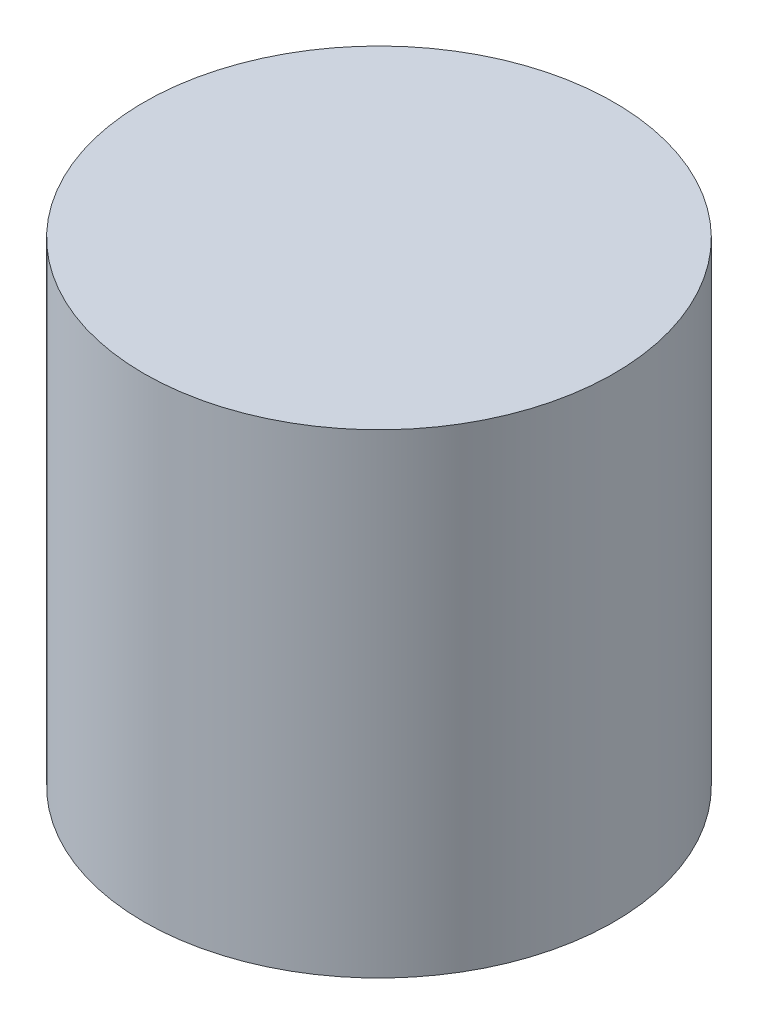
ISO-10303-21;
HEADER;
FILE_DESCRIPTION(('STEP AP214'),'2;1');
FILE_NAME('part.step','',(''),(''),'','','');
FILE_SCHEMA(('AUTOMOTIVE_DESIGN { 1 0 10303 214 1 1 1 1 }'));
ENDSEC;
DATA;
#1=APPLICATION_CONTEXT('core data for automotive mechanical design processes');
#2=APPLICATION_PROTOCOL_DEFINITION('international standard','automotive_design',2000,#1);
#3=PRODUCT_CONTEXT('',#1,'mechanical');
#4=PRODUCT('Part','Part','',(#3));
#5=PRODUCT_RELATED_PRODUCT_CATEGORY('part','',(#4));
#6=PRODUCT_DEFINITION_FORMATION('','',#4);
#7=PRODUCT_DEFINITION_CONTEXT('part definition',#1,'design');
#8=PRODUCT_DEFINITION('design','',#6,#7);
#9=PRODUCT_DEFINITION_SHAPE('','',#8);
#10=(LENGTH_UNIT() NAMED_UNIT(*) SI_UNIT(.MILLI.,.METRE.));
#11=(NAMED_UNIT(*) PLANE_ANGLE_UNIT() SI_UNIT($,.RADIAN.));
#12=(NAMED_UNIT(*) SI_UNIT($,.STERADIAN.) SOLID_ANGLE_UNIT());
#13=UNCERTAINTY_MEASURE_WITH_UNIT(LENGTH_MEASURE(1.E-05),#10,'distance_accuracy_value','');
#14=(GEOMETRIC_REPRESENTATION_CONTEXT(3) GLOBAL_UNCERTAINTY_ASSIGNED_CONTEXT((#13)) GLOBAL_UNIT_ASSIGNED_CONTEXT((#10,
#11,#12)) REPRESENTATION_CONTEXT('',''));
#15=CARTESIAN_POINT('',(0.,0.,0.));
#16=DIRECTION('',(0.,0.,1.));
#17=DIRECTION('',(1.,0.,0.));
#18=AXIS2_PLACEMENT_3D('',#15,#16,#17);
#19=CARTESIAN_POINT('',(0.,20.,0.));
#20=DIRECTION('',(0.,-1.,0.));
#21=DIRECTION('',(0.,0.,-1.));
#22=AXIS2_PLACEMENT_3D('',#19,#20,#21);
#23=CYLINDRICAL_SURFACE('',#22,9.9);
#24=CARTESIAN_POINT('',(0.,20.,0.));
#25=DIRECTION('',(0.,1.,0.));
#26=DIRECTION('',(0.,0.,1.));
#27=AXIS2_PLACEMENT_3D('',#24,#25,#26);
#28=CIRCLE('',#27,9.9);
#29=CARTESIAN_POINT('',(0.,20.,9.9));
#30=VERTEX_POINT('',#29);
#31=EDGE_CURVE('E10',#30,#30,#28,.T.);
#32=ORIENTED_EDGE('',*,*,#31,.F.);
#33=EDGE_LOOP('',(#32));
#34=FACE_BOUND('',#33,.T.);
#35=CARTESIAN_POINT('',(0.,0.,0.));
#36=DIRECTION('',(0.,1.,0.));
#37=DIRECTION('',(0.,0.,1.));
#38=AXIS2_PLACEMENT_3D('',#35,#36,#37);
#39=CIRCLE('',#38,9.9);
#40=CARTESIAN_POINT('',(0.,0.,9.9));
#41=VERTEX_POINT('',#40);
#42=EDGE_CURVE('E46',#41,#41,#39,.T.);
#43=ORIENTED_EDGE('',*,*,#42,.T.);
#44=EDGE_LOOP('',(#43));
#45=FACE_BOUND('',#44,.T.);
#46=ADVANCED_FACE('F43',(#34,#45),#23,.T.);
#47=CARTESIAN_POINT('',(0.,20.,0.));
#48=DIRECTION('',(0.,1.,0.));
#49=DIRECTION('',(0.,0.,1.));
#50=AXIS2_PLACEMENT_3D('',#47,#48,#49);
#51=PLANE('',#50);
#52=ORIENTED_EDGE('',*,*,#31,.T.);
#53=EDGE_LOOP('',(#52));
#54=FACE_BOUND('',#53,.T.);
#55=ADVANCED_FACE('F60',(#54),#51,.T.);
#56=CARTESIAN_POINT('',(0.,0.,0.));
#57=DIRECTION('',(0.,1.,0.));
#58=DIRECTION('',(0.,0.,1.));
#59=AXIS2_PLACEMENT_3D('',#56,#57,#58);
#60=PLANE('',#59);
#61=ORIENTED_EDGE('',*,*,#42,.F.);
#62=EDGE_LOOP('',(#61));
#63=FACE_BOUND('',#62,.T.);
#64=ADVANCED_FACE('F58',(#63),#60,.F.);
#65=CLOSED_SHELL('',(#46,#55,#64));
#66=MANIFOLD_SOLID_BREP('B2',#65);
#67=ADVANCED_BREP_SHAPE_REPRESENTATION('',(#18,#66),#14);
#68=SHAPE_DEFINITION_REPRESENTATION(#9,#67);
ENDSEC;
END-ISO-10303-21;
